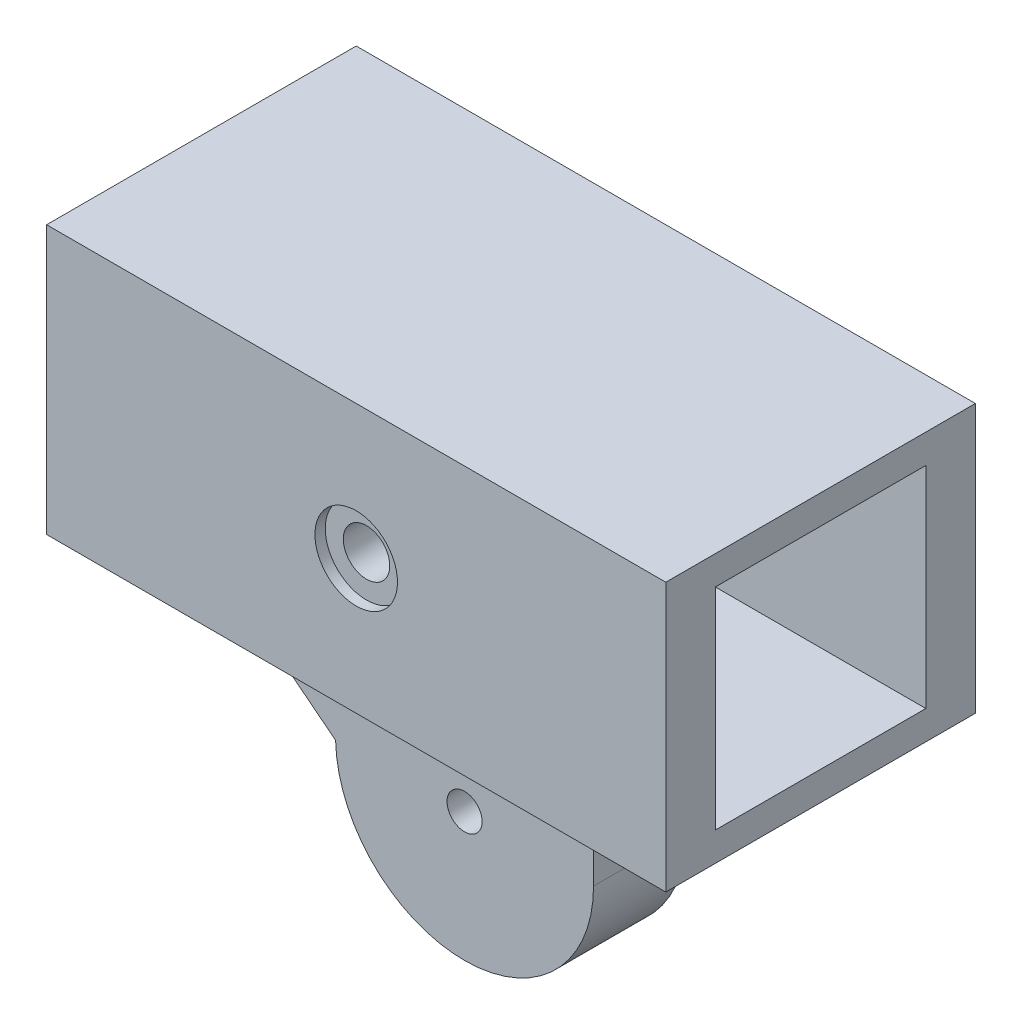
ISO-10303-21;
HEADER;
FILE_DESCRIPTION(('STEP AP214'),'2;1');
FILE_NAME('part.step','',(''),(''),'','','');
FILE_SCHEMA(('AUTOMOTIVE_DESIGN { 1 0 10303 214 1 1 1 1 }'));
ENDSEC;
DATA;
#1=APPLICATION_CONTEXT('core data for automotive mechanical design processes');
#2=APPLICATION_PROTOCOL_DEFINITION('international standard','automotive_design',2000,#1);
#3=PRODUCT_CONTEXT('',#1,'mechanical');
#4=PRODUCT('Part','Part','',(#3));
#5=PRODUCT_RELATED_PRODUCT_CATEGORY('part','',(#4));
#6=PRODUCT_DEFINITION_FORMATION('','',#4);
#7=PRODUCT_DEFINITION_CONTEXT('part definition',#1,'design');
#8=PRODUCT_DEFINITION('design','',#6,#7);
#9=PRODUCT_DEFINITION_SHAPE('','',#8);
#10=(LENGTH_UNIT() NAMED_UNIT(*) SI_UNIT(.MILLI.,.METRE.));
#11=(NAMED_UNIT(*) PLANE_ANGLE_UNIT() SI_UNIT($,.RADIAN.));
#12=(NAMED_UNIT(*) SI_UNIT($,.STERADIAN.) SOLID_ANGLE_UNIT());
#13=UNCERTAINTY_MEASURE_WITH_UNIT(LENGTH_MEASURE(1.E-05),#10,'distance_accuracy_value','');
#14=(GEOMETRIC_REPRESENTATION_CONTEXT(3) GLOBAL_UNCERTAINTY_ASSIGNED_CONTEXT((#13)) GLOBAL_UNIT_ASSIGNED_CONTEXT((#10,
#11,#12)) REPRESENTATION_CONTEXT('',''));
#15=CARTESIAN_POINT('',(0.,0.,0.));
#16=DIRECTION('',(0.,0.,1.));
#17=DIRECTION('',(1.,0.,0.));
#18=AXIS2_PLACEMENT_3D('',#15,#16,#17);
#19=CARTESIAN_POINT('',(60.,26.,-15.));
#20=DIRECTION('',(0.,0.,1.));
#21=DIRECTION('',(0.,-1.,0.));
#22=AXIS2_PLACEMENT_3D('',#19,#20,#21);
#23=PLANE('',#22);
#24=DIRECTION('',(0.,1.,0.));
#25=VECTOR('',#24,1.);
#26=CARTESIAN_POINT('',(0.,26.,-15.));
#27=LINE('',#26,#25);
#28=CARTESIAN_POINT('',(0.,0.,-15.));
#29=VERTEX_POINT('',#28);
#30=CARTESIAN_POINT('',(0.,26.,-15.));
#31=VERTEX_POINT('',#30);
#32=EDGE_CURVE('E204',#29,#31,#27,.T.);
#33=ORIENTED_EDGE('',*,*,#32,.T.);
#34=DIRECTION('',(-1.,0.,0.));
#35=VECTOR('',#34,1.);
#36=CARTESIAN_POINT('',(60.,26.,-15.));
#37=LINE('',#36,#35);
#38=CARTESIAN_POINT('',(60.,26.,-15.));
#39=VERTEX_POINT('',#38);
#40=EDGE_CURVE('E209',#39,#31,#37,.T.);
#41=ORIENTED_EDGE('',*,*,#40,.F.);
#42=DIRECTION('',(0.,1.,0.));
#43=VECTOR('',#42,1.);
#44=CARTESIAN_POINT('',(60.,26.,-15.));
#45=LINE('',#44,#43);
#46=CARTESIAN_POINT('',(60.,0.,-15.));
#47=VERTEX_POINT('',#46);
#48=EDGE_CURVE('E193',#47,#39,#45,.T.);
#49=ORIENTED_EDGE('',*,*,#48,.F.);
#50=DIRECTION('',(-1.,0.,0.));
#51=VECTOR('',#50,1.);
#52=CARTESIAN_POINT('',(60.,0.,-15.));
#53=LINE('',#52,#51);
#54=EDGE_CURVE('E42',#47,#29,#53,.T.);
#55=ORIENTED_EDGE('',*,*,#54,.T.);
#56=EDGE_LOOP('',(#33,#41,#49,#55));
#57=FACE_BOUND('',#56,.T.);
#58=CARTESIAN_POINT('',(30.,13.,-15.));
#59=DIRECTION('',(0.,0.,-1.));
#60=DIRECTION('',(-1.,0.,0.));
#61=AXIS2_PLACEMENT_3D('',#58,#59,#60);
#62=CIRCLE('',#61,3.99999999999999);
#63=CARTESIAN_POINT('',(26.,13.,-15.));
#64=VERTEX_POINT('',#63);
#65=EDGE_CURVE('E420',#64,#64,#62,.T.);
#66=ORIENTED_EDGE('',*,*,#65,.F.);
#67=EDGE_LOOP('',(#66));
#68=FACE_BOUND('',#67,.T.);
#69=ADVANCED_FACE('F34',(#57,#68),#23,.F.);
#70=CARTESIAN_POINT('',(60.,26.,15.));
#71=DIRECTION('',(0.,0.,-1.));
#72=DIRECTION('',(0.,1.,0.));
#73=AXIS2_PLACEMENT_3D('',#70,#71,#72);
#74=PLANE('',#73);
#75=DIRECTION('',(0.,-1.,0.));
#76=VECTOR('',#75,1.);
#77=CARTESIAN_POINT('',(0.,26.,15.));
#78=LINE('',#77,#76);
#79=CARTESIAN_POINT('',(0.,26.,15.));
#80=VERTEX_POINT('',#79);
#81=CARTESIAN_POINT('',(0.,0.,15.));
#82=VERTEX_POINT('',#81);
#83=EDGE_CURVE('E186',#80,#82,#78,.T.);
#84=ORIENTED_EDGE('',*,*,#83,.T.);
#85=DIRECTION('',(-1.,0.,0.));
#86=VECTOR('',#85,1.);
#87=CARTESIAN_POINT('',(60.,0.,15.));
#88=LINE('',#87,#86);
#89=CARTESIAN_POINT('',(60.,0.,15.));
#90=VERTEX_POINT('',#89);
#91=EDGE_CURVE('E11',#90,#82,#88,.T.);
#92=ORIENTED_EDGE('',*,*,#91,.F.);
#93=DIRECTION('',(0.,-1.,0.));
#94=VECTOR('',#93,1.);
#95=CARTESIAN_POINT('',(60.,26.,15.));
#96=LINE('',#95,#94);
#97=CARTESIAN_POINT('',(60.,26.,15.));
#98=VERTEX_POINT('',#97);
#99=EDGE_CURVE('E187',#98,#90,#96,.T.);
#100=ORIENTED_EDGE('',*,*,#99,.F.);
#101=DIRECTION('',(-1.,0.,0.));
#102=VECTOR('',#101,1.);
#103=CARTESIAN_POINT('',(60.,26.,15.));
#104=LINE('',#103,#102);
#105=EDGE_CURVE('E197',#98,#80,#104,.T.);
#106=ORIENTED_EDGE('',*,*,#105,.T.);
#107=EDGE_LOOP('',(#84,#92,#100,#106));
#108=FACE_BOUND('',#107,.T.);
#109=CARTESIAN_POINT('',(30.,13.,15.));
#110=DIRECTION('',(0.,0.,1.));
#111=DIRECTION('',(1.,0.,0.));
#112=AXIS2_PLACEMENT_3D('',#109,#110,#111);
#113=CIRCLE('',#112,3.99999999999999);
#114=CARTESIAN_POINT('',(34.,13.,15.));
#115=VERTEX_POINT('',#114);
#116=EDGE_CURVE('E430',#115,#115,#113,.T.);
#117=ORIENTED_EDGE('',*,*,#116,.F.);
#118=EDGE_LOOP('',(#117));
#119=FACE_BOUND('',#118,.T.);
#120=ADVANCED_FACE('F36',(#108,#119),#74,.F.);
#121=CARTESIAN_POINT('',(60.,0.,15.));
#122=DIRECTION('',(0.,1.,0.));
#123=DIRECTION('',(0.,0.,1.));
#124=AXIS2_PLACEMENT_3D('',#121,#122,#123);
#125=PLANE('',#124);
#126=DIRECTION('',(0.,0.,-1.));
#127=VECTOR('',#126,1.);
#128=CARTESIAN_POINT('',(0.,0.,15.));
#129=LINE('',#128,#127);
#130=CARTESIAN_POINT('',(0.,0.,4.5));
#131=VERTEX_POINT('',#130);
#132=EDGE_CURVE('E201',#82,#131,#129,.T.);
#133=ORIENTED_EDGE('',*,*,#132,.T.);
#134=DIRECTION('',(-1.,0.,0.));
#135=VECTOR('',#134,1.);
#136=CARTESIAN_POINT('',(42.5,0.,4.5));
#137=LINE('',#136,#135);
#138=CARTESIAN_POINT('',(42.5,0.,4.5));
#139=VERTEX_POINT('',#138);
#140=EDGE_CURVE('E57',#139,#131,#137,.T.);
#141=ORIENTED_EDGE('',*,*,#140,.F.);
#142=DIRECTION('',(0.,0.,-1.));
#143=VECTOR('',#142,1.);
#144=CARTESIAN_POINT('',(42.5,0.,4.5));
#145=LINE('',#144,#143);
#146=CARTESIAN_POINT('',(42.5,0.,-4.5));
#147=VERTEX_POINT('',#146);
#148=EDGE_CURVE('E176',#139,#147,#145,.T.);
#149=ORIENTED_EDGE('',*,*,#148,.T.);
#150=DIRECTION('',(-1.,0.,0.));
#151=VECTOR('',#150,1.);
#152=CARTESIAN_POINT('',(42.5,0.,-4.5));
#153=LINE('',#152,#151);
#154=CARTESIAN_POINT('',(0.,0.,-4.5));
#155=VERTEX_POINT('',#154);
#156=EDGE_CURVE('E49',#147,#155,#153,.T.);
#157=ORIENTED_EDGE('',*,*,#156,.T.);
#158=EDGE_CURVE('E200',#155,#29,#129,.T.);
#159=ORIENTED_EDGE('',*,*,#158,.T.);
#160=ORIENTED_EDGE('',*,*,#54,.F.);
#161=DIRECTION('',(0.,0.,-1.));
#162=VECTOR('',#161,1.);
#163=CARTESIAN_POINT('',(60.,0.,15.));
#164=LINE('',#163,#162);
#165=EDGE_CURVE('E190',#90,#47,#164,.T.);
#166=ORIENTED_EDGE('',*,*,#165,.F.);
#167=ORIENTED_EDGE('',*,*,#91,.T.);
#168=EDGE_LOOP('',(#133,#141,#149,#157,#159,#160,#166,#167));
#169=FACE_BOUND('',#168,.T.);
#170=ADVANCED_FACE('F231',(#169),#125,.F.);
#171=CARTESIAN_POINT('',(60.,26.,15.));
#172=DIRECTION('',(0.,-1.,0.));
#173=DIRECTION('',(0.,0.,-1.));
#174=AXIS2_PLACEMENT_3D('',#171,#172,#173);
#175=PLANE('',#174);
#176=ORIENTED_EDGE('',*,*,#105,.F.);
#177=DIRECTION('',(0.,0.,1.));
#178=VECTOR('',#177,1.);
#179=CARTESIAN_POINT('',(60.,26.,15.));
#180=LINE('',#179,#178);
#181=EDGE_CURVE('E195',#39,#98,#180,.T.);
#182=ORIENTED_EDGE('',*,*,#181,.F.);
#183=ORIENTED_EDGE('',*,*,#40,.T.);
#184=DIRECTION('',(0.,0.,1.));
#185=VECTOR('',#184,1.);
#186=CARTESIAN_POINT('',(0.,26.,15.));
#187=LINE('',#186,#185);
#188=EDGE_CURVE('E191',#31,#80,#187,.T.);
#189=ORIENTED_EDGE('',*,*,#188,.T.);
#190=EDGE_LOOP('',(#176,#182,#183,#189));
#191=FACE_BOUND('',#190,.T.);
#192=ADVANCED_FACE('F225',(#191),#175,.F.);
#193=CARTESIAN_POINT('',(60.,0.,0.));
#194=DIRECTION('',(1.,0.,0.));
#195=DIRECTION('',(0.,0.,-1.));
#196=AXIS2_PLACEMENT_3D('',#193,#194,#195);
#197=PLANE('',#196);
#198=DIRECTION('',(0.,0.,-1.));
#199=VECTOR('',#198,1.);
#200=CARTESIAN_POINT('',(60.,23.2,-10.2));
#201=LINE('',#200,#199);
#202=CARTESIAN_POINT('',(60.,23.2,10.2));
#203=VERTEX_POINT('',#202);
#204=CARTESIAN_POINT('',(60.,23.2,-10.2));
#205=VERTEX_POINT('',#204);
#206=EDGE_CURVE('E138',#203,#205,#201,.T.);
#207=ORIENTED_EDGE('',*,*,#206,.T.);
#208=DIRECTION('',(0.,-1.,0.));
#209=VECTOR('',#208,1.);
#210=CARTESIAN_POINT('',(60.,23.2,-10.2));
#211=LINE('',#210,#209);
#212=CARTESIAN_POINT('',(60.,2.8,-10.2));
#213=VERTEX_POINT('',#212);
#214=EDGE_CURVE('E144',#205,#213,#211,.T.);
#215=ORIENTED_EDGE('',*,*,#214,.T.);
#216=DIRECTION('',(0.,0.,1.));
#217=VECTOR('',#216,1.);
#218=CARTESIAN_POINT('',(60.,2.8,-10.2));
#219=LINE('',#218,#217);
#220=CARTESIAN_POINT('',(60.,2.8,10.2));
#221=VERTEX_POINT('',#220);
#222=EDGE_CURVE('E135',#213,#221,#219,.T.);
#223=ORIENTED_EDGE('',*,*,#222,.T.);
#224=DIRECTION('',(0.,1.,0.));
#225=VECTOR('',#224,1.);
#226=CARTESIAN_POINT('',(60.,23.2,10.2));
#227=LINE('',#226,#225);
#228=EDGE_CURVE('E129',#221,#203,#227,.T.);
#229=ORIENTED_EDGE('',*,*,#228,.T.);
#230=EDGE_LOOP('',(#207,#215,#223,#229));
#231=FACE_BOUND('',#230,.T.);
#232=ORIENTED_EDGE('',*,*,#181,.T.);
#233=ORIENTED_EDGE('',*,*,#99,.T.);
#234=ORIENTED_EDGE('',*,*,#165,.T.);
#235=ORIENTED_EDGE('',*,*,#48,.T.);
#236=EDGE_LOOP('',(#232,#233,#234,#235));
#237=FACE_BOUND('',#236,.T.);
#238=ADVANCED_FACE('F146',(#231,#237),#197,.T.);
#239=CARTESIAN_POINT('',(0.,0.,0.));
#240=DIRECTION('',(1.,0.,0.));
#241=DIRECTION('',(0.,0.,-1.));
#242=AXIS2_PLACEMENT_3D('',#239,#240,#241);
#243=PLANE('',#242);
#244=DIRECTION('',(0.,-1.,0.));
#245=VECTOR('',#244,1.);
#246=CARTESIAN_POINT('',(0.,23.2,-10.2));
#247=LINE('',#246,#245);
#248=CARTESIAN_POINT('',(0.,23.2,-10.2));
#249=VERTEX_POINT('',#248);
#250=CARTESIAN_POINT('',(0.,2.8,-10.2));
#251=VERTEX_POINT('',#250);
#252=EDGE_CURVE('E152',#249,#251,#247,.T.);
#253=ORIENTED_EDGE('',*,*,#252,.F.);
#254=DIRECTION('',(0.,0.,-1.));
#255=VECTOR('',#254,1.);
#256=CARTESIAN_POINT('',(0.,23.2,-10.2));
#257=LINE('',#256,#255);
#258=CARTESIAN_POINT('',(0.,23.2,10.2));
#259=VERTEX_POINT('',#258);
#260=EDGE_CURVE('E161',#259,#249,#257,.T.);
#261=ORIENTED_EDGE('',*,*,#260,.F.);
#262=DIRECTION('',(0.,1.,0.));
#263=VECTOR('',#262,1.);
#264=CARTESIAN_POINT('',(0.,23.2,10.2));
#265=LINE('',#264,#263);
#266=CARTESIAN_POINT('',(0.,2.8,10.2));
#267=VERTEX_POINT('',#266);
#268=EDGE_CURVE('E131',#267,#259,#265,.T.);
#269=ORIENTED_EDGE('',*,*,#268,.F.);
#270=DIRECTION('',(0.,0.,1.));
#271=VECTOR('',#270,1.);
#272=CARTESIAN_POINT('',(0.,2.8,-10.2));
#273=LINE('',#272,#271);
#274=EDGE_CURVE('E150',#251,#267,#273,.T.);
#275=ORIENTED_EDGE('',*,*,#274,.F.);
#276=EDGE_LOOP('',(#253,#261,#269,#275));
#277=FACE_BOUND('',#276,.T.);
#278=ORIENTED_EDGE('',*,*,#83,.F.);
#279=ORIENTED_EDGE('',*,*,#188,.F.);
#280=ORIENTED_EDGE('',*,*,#32,.F.);
#281=ORIENTED_EDGE('',*,*,#158,.F.);
#282=DIRECTION('',(0.,0.,-1.));
#283=VECTOR('',#282,1.);
#284=CARTESIAN_POINT('',(0.,0.,0.));
#285=LINE('',#284,#283);
#286=EDGE_CURVE('E238',#131,#155,#285,.T.);
#287=ORIENTED_EDGE('',*,*,#286,.F.);
#288=ORIENTED_EDGE('',*,*,#132,.F.);
#289=EDGE_LOOP('',(#278,#279,#280,#281,#287,#288));
#290=FACE_BOUND('',#289,.T.);
#291=ADVANCED_FACE('F221',(#277,#290),#243,.F.);
#292=CARTESIAN_POINT('',(30.,-13.5,4.5));
#293=DIRECTION('',(0.,0.,-1.));
#294=DIRECTION('',(-1.,0.,0.));
#295=AXIS2_PLACEMENT_3D('',#292,#293,#294);
#296=CYLINDRICAL_SURFACE('',#295,12.5);
#297=CARTESIAN_POINT('',(30.,-13.5,4.5));
#298=DIRECTION('',(0.,0.,1.));
#299=DIRECTION('',(1.,0.,0.));
#300=AXIS2_PLACEMENT_3D('',#297,#298,#299);
#301=CIRCLE('',#300,12.5);
#302=CARTESIAN_POINT('',(17.502904909039,-13.7694703833045,4.5));
#303=VERTEX_POINT('',#302);
#304=CARTESIAN_POINT('',(42.5,-13.5,4.5));
#305=VERTEX_POINT('',#304);
#306=EDGE_CURVE('E171',#303,#305,#301,.T.);
#307=ORIENTED_EDGE('',*,*,#306,.F.);
#308=DIRECTION('',(0.,0.,-1.));
#309=VECTOR('',#308,1.);
#310=CARTESIAN_POINT('',(17.502904909039,-13.7694703833045,4.5));
#311=LINE('',#310,#309);
#312=CARTESIAN_POINT('',(17.502904909039,-13.7694703833045,-4.5));
#313=VERTEX_POINT('',#312);
#314=EDGE_CURVE('E240',#303,#313,#311,.T.);
#315=ORIENTED_EDGE('',*,*,#314,.T.);
#316=CARTESIAN_POINT('',(30.,-13.5,-4.5));
#317=DIRECTION('',(0.,0.,1.));
#318=DIRECTION('',(1.,0.,0.));
#319=AXIS2_PLACEMENT_3D('',#316,#317,#318);
#320=CIRCLE('',#319,12.5);
#321=CARTESIAN_POINT('',(42.5,-13.5,-4.5));
#322=VERTEX_POINT('',#321);
#323=EDGE_CURVE('E178',#313,#322,#320,.T.);
#324=ORIENTED_EDGE('',*,*,#323,.T.);
#325=DIRECTION('',(0.,0.,-1.));
#326=VECTOR('',#325,1.);
#327=CARTESIAN_POINT('',(42.5,-13.5,4.5));
#328=LINE('',#327,#326);
#329=EDGE_CURVE('E183',#305,#322,#328,.T.);
#330=ORIENTED_EDGE('',*,*,#329,.F.);
#331=EDGE_LOOP('',(#307,#315,#324,#330));
#332=FACE_BOUND('',#331,.T.);
#333=ADVANCED_FACE('F288',(#332),#296,.T.);
#334=CARTESIAN_POINT('',(42.5,-13.5,4.5));
#335=DIRECTION('',(-1.,0.,0.));
#336=DIRECTION('',(0.,-1.,0.));
#337=AXIS2_PLACEMENT_3D('',#334,#335,#336);
#338=PLANE('',#337);
#339=DIRECTION('',(0.,1.,0.));
#340=VECTOR('',#339,1.);
#341=CARTESIAN_POINT('',(42.5,-13.5,-4.5));
#342=LINE('',#341,#340);
#343=EDGE_CURVE('E172',#322,#147,#342,.T.);
#344=ORIENTED_EDGE('',*,*,#343,.T.);
#345=ORIENTED_EDGE('',*,*,#148,.F.);
#346=DIRECTION('',(0.,1.,0.));
#347=VECTOR('',#346,1.);
#348=CARTESIAN_POINT('',(42.5,-13.5,4.5));
#349=LINE('',#348,#347);
#350=EDGE_CURVE('E174',#305,#139,#349,.T.);
#351=ORIENTED_EDGE('',*,*,#350,.F.);
#352=ORIENTED_EDGE('',*,*,#329,.T.);
#353=EDGE_LOOP('',(#344,#345,#351,#352));
#354=FACE_BOUND('',#353,.T.);
#355=ADVANCED_FACE('F293',(#354),#338,.F.);
#356=CARTESIAN_POINT('',(30.,-13.5,4.5));
#357=DIRECTION('',(0.,0.,1.));
#358=DIRECTION('',(1.,0.,0.));
#359=AXIS2_PLACEMENT_3D('',#356,#357,#358);
#360=PLANE('',#359);
#361=ORIENTED_EDGE('',*,*,#306,.T.);
#362=ORIENTED_EDGE('',*,*,#350,.T.);
#363=ORIENTED_EDGE('',*,*,#140,.T.);
#364=DIRECTION('',(0.78594324975447,-0.618298639951102,0.));
#365=VECTOR('',#364,1.);
#366=CARTESIAN_POINT('',(0.,0.,4.5));
#367=LINE('',#366,#365);
#368=EDGE_CURVE('E235',#131,#303,#367,.T.);
#369=ORIENTED_EDGE('',*,*,#368,.T.);
#370=EDGE_LOOP('',(#361,#362,#363,#369));
#371=FACE_BOUND('',#370,.T.);
#372=CARTESIAN_POINT('',(30.,-13.5,4.5));
#373=DIRECTION('',(0.,0.,1.));
#374=DIRECTION('',(1.,0.,0.));
#375=AXIS2_PLACEMENT_3D('',#372,#373,#374);
#376=CIRCLE('',#375,1.7);
#377=CARTESIAN_POINT('',(31.7,-13.5,4.5));
#378=VERTEX_POINT('',#377);
#379=EDGE_CURVE('E249',#378,#378,#376,.T.);
#380=ORIENTED_EDGE('',*,*,#379,.F.);
#381=EDGE_LOOP('',(#380));
#382=FACE_BOUND('',#381,.T.);
#383=ADVANCED_FACE('F297',(#371,#382),#360,.T.);
#384=CARTESIAN_POINT('',(30.,-13.5,-4.5));
#385=DIRECTION('',(0.,0.,1.));
#386=DIRECTION('',(1.,0.,0.));
#387=AXIS2_PLACEMENT_3D('',#384,#385,#386);
#388=PLANE('',#387);
#389=ORIENTED_EDGE('',*,*,#323,.F.);
#390=DIRECTION('',(0.78594324975447,-0.618298639951102,0.));
#391=VECTOR('',#390,1.);
#392=CARTESIAN_POINT('',(0.,0.,-4.5));
#393=LINE('',#392,#391);
#394=EDGE_CURVE('E241',#155,#313,#393,.T.);
#395=ORIENTED_EDGE('',*,*,#394,.F.);
#396=ORIENTED_EDGE('',*,*,#156,.F.);
#397=ORIENTED_EDGE('',*,*,#343,.F.);
#398=EDGE_LOOP('',(#389,#395,#396,#397));
#399=FACE_BOUND('',#398,.T.);
#400=CARTESIAN_POINT('',(30.,-13.5,-4.5));
#401=DIRECTION('',(0.,0.,1.));
#402=DIRECTION('',(1.,0.,0.));
#403=AXIS2_PLACEMENT_3D('',#400,#401,#402);
#404=CIRCLE('',#403,1.7);
#405=CARTESIAN_POINT('',(31.7,-13.5,-4.5));
#406=VERTEX_POINT('',#405);
#407=EDGE_CURVE('E155',#406,#406,#404,.T.);
#408=ORIENTED_EDGE('',*,*,#407,.T.);
#409=EDGE_LOOP('',(#408));
#410=FACE_BOUND('',#409,.T.);
#411=ADVANCED_FACE('F256',(#399,#410),#388,.F.);
#412=CARTESIAN_POINT('',(60.,23.2,10.2));
#413=DIRECTION('',(0.,0.,1.));
#414=DIRECTION('',(0.,-1.,0.));
#415=AXIS2_PLACEMENT_3D('',#412,#413,#414);
#416=PLANE('',#415);
#417=CARTESIAN_POINT('',(30.,13.,10.2));
#418=DIRECTION('',(0.,0.,1.));
#419=DIRECTION('',(0.,-1.,0.));
#420=AXIS2_PLACEMENT_3D('',#417,#418,#419);
#421=CIRCLE('',#420,2.25);
#422=CARTESIAN_POINT('',(30.,10.75,10.2));
#423=VERTEX_POINT('',#422);
#424=EDGE_CURVE('E244',#423,#423,#421,.T.);
#425=ORIENTED_EDGE('',*,*,#424,.T.);
#426=EDGE_LOOP('',(#425));
#427=FACE_BOUND('',#426,.T.);
#428=ORIENTED_EDGE('',*,*,#268,.T.);
#429=DIRECTION('',(-1.,0.,0.));
#430=VECTOR('',#429,1.);
#431=CARTESIAN_POINT('',(60.,23.2,10.2));
#432=LINE('',#431,#430);
#433=EDGE_CURVE('E124',#203,#259,#432,.T.);
#434=ORIENTED_EDGE('',*,*,#433,.F.);
#435=ORIENTED_EDGE('',*,*,#228,.F.);
#436=DIRECTION('',(-1.,0.,0.));
#437=VECTOR('',#436,1.);
#438=CARTESIAN_POINT('',(60.,2.8,10.2));
#439=LINE('',#438,#437);
#440=EDGE_CURVE('E165',#221,#267,#439,.T.);
#441=ORIENTED_EDGE('',*,*,#440,.T.);
#442=EDGE_LOOP('',(#428,#434,#435,#441));
#443=FACE_BOUND('',#442,.T.);
#444=ADVANCED_FACE('F126',(#427,#443),#416,.F.);
#445=CARTESIAN_POINT('',(60.,2.8,-10.2));
#446=DIRECTION('',(0.,-1.,0.));
#447=DIRECTION('',(0.,0.,-1.));
#448=AXIS2_PLACEMENT_3D('',#445,#446,#447);
#449=PLANE('',#448);
#450=ORIENTED_EDGE('',*,*,#440,.F.);
#451=ORIENTED_EDGE('',*,*,#222,.F.);
#452=DIRECTION('',(-1.,0.,0.));
#453=VECTOR('',#452,1.);
#454=CARTESIAN_POINT('',(60.,2.8,-10.2));
#455=LINE('',#454,#453);
#456=EDGE_CURVE('E167',#213,#251,#455,.T.);
#457=ORIENTED_EDGE('',*,*,#456,.T.);
#458=ORIENTED_EDGE('',*,*,#274,.T.);
#459=EDGE_LOOP('',(#450,#451,#457,#458));
#460=FACE_BOUND('',#459,.T.);
#461=ADVANCED_FACE('F305',(#460),#449,.F.);
#462=CARTESIAN_POINT('',(60.,23.2,-10.2));
#463=DIRECTION('',(0.,0.,-1.));
#464=DIRECTION('',(0.,1.,0.));
#465=AXIS2_PLACEMENT_3D('',#462,#463,#464);
#466=PLANE('',#465);
#467=CARTESIAN_POINT('',(30.,13.,-10.2));
#468=DIRECTION('',(0.,0.,-1.));
#469=DIRECTION('',(0.,1.,0.));
#470=AXIS2_PLACEMENT_3D('',#467,#468,#469);
#471=CIRCLE('',#470,2.25);
#472=CARTESIAN_POINT('',(30.,15.25,-10.2));
#473=VERTEX_POINT('',#472);
#474=EDGE_CURVE('E427',#473,#473,#471,.T.);
#475=ORIENTED_EDGE('',*,*,#474,.T.);
#476=EDGE_LOOP('',(#475));
#477=FACE_BOUND('',#476,.T.);
#478=ORIENTED_EDGE('',*,*,#252,.T.);
#479=ORIENTED_EDGE('',*,*,#456,.F.);
#480=ORIENTED_EDGE('',*,*,#214,.F.);
#481=DIRECTION('',(-1.,0.,0.));
#482=VECTOR('',#481,1.);
#483=CARTESIAN_POINT('',(60.,23.2,-10.2));
#484=LINE('',#483,#482);
#485=EDGE_CURVE('E134',#205,#249,#484,.T.);
#486=ORIENTED_EDGE('',*,*,#485,.T.);
#487=EDGE_LOOP('',(#478,#479,#480,#486));
#488=FACE_BOUND('',#487,.T.);
#489=ADVANCED_FACE('F267',(#477,#488),#466,.F.);
#490=CARTESIAN_POINT('',(60.,23.2,-10.2));
#491=DIRECTION('',(0.,1.,0.));
#492=DIRECTION('',(0.,0.,1.));
#493=AXIS2_PLACEMENT_3D('',#490,#491,#492);
#494=PLANE('',#493);
#495=ORIENTED_EDGE('',*,*,#260,.T.);
#496=ORIENTED_EDGE('',*,*,#485,.F.);
#497=ORIENTED_EDGE('',*,*,#206,.F.);
#498=ORIENTED_EDGE('',*,*,#433,.T.);
#499=EDGE_LOOP('',(#495,#496,#497,#498));
#500=FACE_BOUND('',#499,.T.);
#501=ADVANCED_FACE('F139',(#500),#494,.F.);
#502=CARTESIAN_POINT('',(30.,-13.5,4.5));
#503=DIRECTION('',(0.,0.,1.));
#504=DIRECTION('',(1.,0.,0.));
#505=AXIS2_PLACEMENT_3D('',#502,#503,#504);
#506=CYLINDRICAL_SURFACE('',#505,1.7);
#507=ORIENTED_EDGE('',*,*,#379,.T.);
#508=EDGE_LOOP('',(#507));
#509=FACE_BOUND('',#508,.T.);
#510=ORIENTED_EDGE('',*,*,#407,.F.);
#511=EDGE_LOOP('',(#510));
#512=FACE_BOUND('',#511,.T.);
#513=ADVANCED_FACE('F258',(#509,#512),#506,.F.);
#514=CARTESIAN_POINT('',(0.,0.,0.));
#515=DIRECTION('',(-0.618298639951102,-0.785943249754471,0.));
#516=DIRECTION('',(0.78594324975447,-0.618298639951102,0.));
#517=AXIS2_PLACEMENT_3D('',#514,#515,#516);
#518=PLANE('',#517);
#519=ORIENTED_EDGE('',*,*,#368,.F.);
#520=ORIENTED_EDGE('',*,*,#286,.T.);
#521=ORIENTED_EDGE('',*,*,#394,.T.);
#522=ORIENTED_EDGE('',*,*,#314,.F.);
#523=EDGE_LOOP('',(#519,#520,#521,#522));
#524=FACE_BOUND('',#523,.T.);
#525=ADVANCED_FACE('F236',(#524),#518,.T.);
#526=CARTESIAN_POINT('',(30.,13.,15.));
#527=DIRECTION('',(0.,0.,1.));
#528=DIRECTION('',(1.,0.,0.));
#529=AXIS2_PLACEMENT_3D('',#526,#527,#528);
#530=CYLINDRICAL_SURFACE('',#529,2.25);
#531=ORIENTED_EDGE('',*,*,#424,.F.);
#532=EDGE_LOOP('',(#531));
#533=FACE_BOUND('',#532,.T.);
#534=CARTESIAN_POINT('',(30.,13.,14.));
#535=DIRECTION('',(0.,0.,1.));
#536=DIRECTION('',(1.,0.,0.));
#537=AXIS2_PLACEMENT_3D('',#534,#535,#536);
#538=CIRCLE('',#537,2.25);
#539=CARTESIAN_POINT('',(32.25,13.,14.));
#540=VERTEX_POINT('',#539);
#541=EDGE_CURVE('E435',#540,#540,#538,.T.);
#542=ORIENTED_EDGE('',*,*,#541,.T.);
#543=EDGE_LOOP('',(#542));
#544=FACE_BOUND('',#543,.T.);
#545=ADVANCED_FACE('F265',(#533,#544),#530,.F.);
#546=CARTESIAN_POINT('',(32.25,13.,14.));
#547=DIRECTION('',(0.,0.,-1.));
#548=DIRECTION('',(-1.,0.,0.));
#549=AXIS2_PLACEMENT_3D('',#546,#547,#548);
#550=PLANE('',#549);
#551=ORIENTED_EDGE('',*,*,#541,.F.);
#552=EDGE_LOOP('',(#551));
#553=FACE_BOUND('',#552,.T.);
#554=CARTESIAN_POINT('',(30.,13.,14.));
#555=DIRECTION('',(0.,0.,1.));
#556=DIRECTION('',(1.,0.,0.));
#557=AXIS2_PLACEMENT_3D('',#554,#555,#556);
#558=CIRCLE('',#557,4.);
#559=CARTESIAN_POINT('',(34.,13.,14.));
#560=VERTEX_POINT('',#559);
#561=EDGE_CURVE('E433',#560,#560,#558,.T.);
#562=ORIENTED_EDGE('',*,*,#561,.T.);
#563=EDGE_LOOP('',(#562));
#564=FACE_BOUND('',#563,.T.);
#565=ADVANCED_FACE('F357',(#553,#564),#550,.F.);
#566=CARTESIAN_POINT('',(30.,13.,15.));
#567=DIRECTION('',(0.,0.,1.));
#568=DIRECTION('',(1.,0.,0.));
#569=AXIS2_PLACEMENT_3D('',#566,#567,#568);
#570=CYLINDRICAL_SURFACE('',#569,4.);
#571=ORIENTED_EDGE('',*,*,#561,.F.);
#572=EDGE_LOOP('',(#571));
#573=FACE_BOUND('',#572,.T.);
#574=ORIENTED_EDGE('',*,*,#116,.T.);
#575=EDGE_LOOP('',(#574));
#576=FACE_BOUND('',#575,.T.);
#577=ADVANCED_FACE('F367',(#573,#576),#570,.F.);
#578=CARTESIAN_POINT('',(30.,13.,-15.));
#579=DIRECTION('',(0.,0.,-1.));
#580=DIRECTION('',(-1.,0.,0.));
#581=AXIS2_PLACEMENT_3D('',#578,#579,#580);
#582=CYLINDRICAL_SURFACE('',#581,2.25);
#583=ORIENTED_EDGE('',*,*,#474,.F.);
#584=EDGE_LOOP('',(#583));
#585=FACE_BOUND('',#584,.T.);
#586=CARTESIAN_POINT('',(30.,13.,-14.));
#587=DIRECTION('',(0.,0.,-1.));
#588=DIRECTION('',(-1.,0.,0.));
#589=AXIS2_PLACEMENT_3D('',#586,#587,#588);
#590=CIRCLE('',#589,2.25);
#591=CARTESIAN_POINT('',(27.75,13.,-14.));
#592=VERTEX_POINT('',#591);
#593=EDGE_CURVE('E422',#592,#592,#590,.T.);
#594=ORIENTED_EDGE('',*,*,#593,.T.);
#595=EDGE_LOOP('',(#594));
#596=FACE_BOUND('',#595,.T.);
#597=ADVANCED_FACE('F376',(#585,#596),#582,.F.);
#598=CARTESIAN_POINT('',(32.25,13.,-14.));
#599=DIRECTION('',(0.,0.,1.));
#600=DIRECTION('',(1.,0.,0.));
#601=AXIS2_PLACEMENT_3D('',#598,#599,#600);
#602=PLANE('',#601);
#603=ORIENTED_EDGE('',*,*,#593,.F.);
#604=EDGE_LOOP('',(#603));
#605=FACE_BOUND('',#604,.T.);
#606=CARTESIAN_POINT('',(30.,13.,-14.));
#607=DIRECTION('',(0.,0.,-1.));
#608=DIRECTION('',(-1.,0.,0.));
#609=AXIS2_PLACEMENT_3D('',#606,#607,#608);
#610=CIRCLE('',#609,4.);
#611=CARTESIAN_POINT('',(26.,13.,-14.));
#612=VERTEX_POINT('',#611);
#613=EDGE_CURVE('E417',#612,#612,#610,.T.);
#614=ORIENTED_EDGE('',*,*,#613,.T.);
#615=EDGE_LOOP('',(#614));
#616=FACE_BOUND('',#615,.T.);
#617=ADVANCED_FACE('F391',(#605,#616),#602,.F.);
#618=CARTESIAN_POINT('',(30.,13.,-15.));
#619=DIRECTION('',(0.,0.,-1.));
#620=DIRECTION('',(-1.,0.,0.));
#621=AXIS2_PLACEMENT_3D('',#618,#619,#620);
#622=CYLINDRICAL_SURFACE('',#621,4.);
#623=ORIENTED_EDGE('',*,*,#613,.F.);
#624=EDGE_LOOP('',(#623));
#625=FACE_BOUND('',#624,.T.);
#626=ORIENTED_EDGE('',*,*,#65,.T.);
#627=EDGE_LOOP('',(#626));
#628=FACE_BOUND('',#627,.T.);
#629=ADVANCED_FACE('F400',(#625,#628),#622,.F.);
#630=CLOSED_SHELL('',(#69,#120,#170,#192,#238,#291,#333,#355,#383,#411,#444,#461,#489,#501,#513,
#525,#545,#565,#577,#597,#617,#629));
#631=MANIFOLD_SOLID_BREP('B2',#630);
#632=ADVANCED_BREP_SHAPE_REPRESENTATION('',(#18,#631),#14);
#633=SHAPE_DEFINITION_REPRESENTATION(#9,#632);
ENDSEC;
END-ISO-10303-21;
